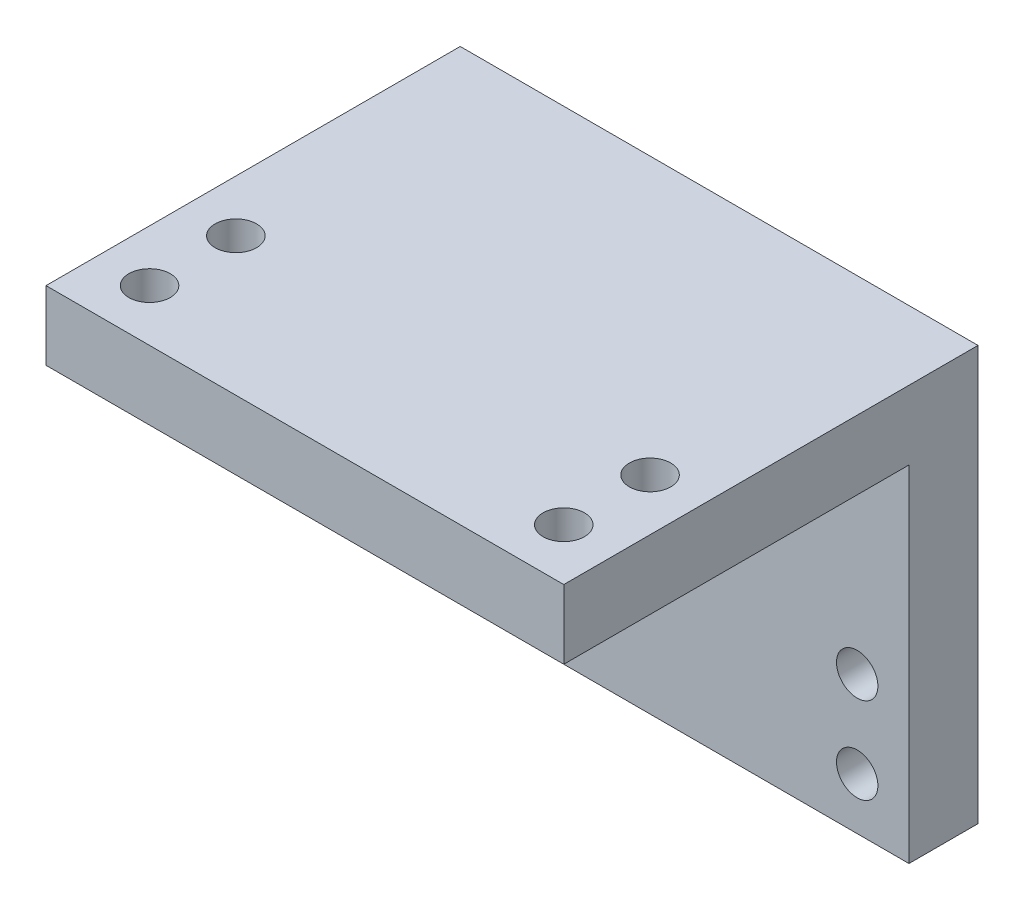
ISO-10303-21;
HEADER;
FILE_DESCRIPTION(('STEP AP214'),'2;1');
FILE_NAME('part.step','',(''),(''),'','','');
FILE_SCHEMA(('AUTOMOTIVE_DESIGN { 1 0 10303 214 1 1 1 1 }'));
ENDSEC;
DATA;
#1=APPLICATION_CONTEXT('core data for automotive mechanical design processes');
#2=APPLICATION_PROTOCOL_DEFINITION('international standard','automotive_design',2000,#1);
#3=PRODUCT_CONTEXT('',#1,'mechanical');
#4=PRODUCT('Part','Part','',(#3));
#5=PRODUCT_RELATED_PRODUCT_CATEGORY('part','',(#4));
#6=PRODUCT_DEFINITION_FORMATION('','',#4);
#7=PRODUCT_DEFINITION_CONTEXT('part definition',#1,'design');
#8=PRODUCT_DEFINITION('design','',#6,#7);
#9=PRODUCT_DEFINITION_SHAPE('','',#8);
#10=(LENGTH_UNIT() NAMED_UNIT(*) SI_UNIT(.MILLI.,.METRE.));
#11=(NAMED_UNIT(*) PLANE_ANGLE_UNIT() SI_UNIT($,.RADIAN.));
#12=(NAMED_UNIT(*) SI_UNIT($,.STERADIAN.) SOLID_ANGLE_UNIT());
#13=UNCERTAINTY_MEASURE_WITH_UNIT(LENGTH_MEASURE(1.E-05),#10,'distance_accuracy_value','');
#14=(GEOMETRIC_REPRESENTATION_CONTEXT(3) GLOBAL_UNCERTAINTY_ASSIGNED_CONTEXT((#13)) GLOBAL_UNIT_ASSIGNED_CONTEXT((#10,
#11,#12)) REPRESENTATION_CONTEXT('',''));
#15=CARTESIAN_POINT('',(0.,0.,0.));
#16=DIRECTION('',(0.,0.,1.));
#17=DIRECTION('',(1.,0.,0.));
#18=AXIS2_PLACEMENT_3D('',#15,#16,#17);
#19=CARTESIAN_POINT('',(38.1,-21.9756544502618,2.18094240837696));
#20=DIRECTION('',(0.,0.,-1.));
#21=DIRECTION('',(-1.,0.,0.));
#22=AXIS2_PLACEMENT_3D('',#19,#20,#21);
#23=PLANE('',#22);
#24=DIRECTION('',(0.,-1.,0.));
#25=VECTOR('',#24,1.);
#26=CARTESIAN_POINT('',(0.,-21.9756544502618,2.18094240837696));
#27=LINE('',#26,#25);
#28=CARTESIAN_POINT('',(0.,-16.8956544502618,2.18094240837696));
#29=VERTEX_POINT('',#28);
#30=CARTESIAN_POINT('',(0.,-21.9756544502618,2.18094240837696));
#31=VERTEX_POINT('',#30);
#32=EDGE_CURVE('E123',#29,#31,#27,.T.);
#33=ORIENTED_EDGE('',*,*,#32,.T.);
#34=DIRECTION('',(-1.,0.,0.));
#35=VECTOR('',#34,1.);
#36=CARTESIAN_POINT('',(38.1,-21.9756544502618,2.18094240837696));
#37=LINE('',#36,#35);
#38=CARTESIAN_POINT('',(38.1,-21.9756544502618,2.18094240837696));
#39=VERTEX_POINT('',#38);
#40=EDGE_CURVE('E11',#39,#31,#37,.T.);
#41=ORIENTED_EDGE('',*,*,#40,.F.);
#42=DIRECTION('',(0.,-1.,0.));
#43=VECTOR('',#42,1.);
#44=CARTESIAN_POINT('',(38.1,-21.9756544502618,2.18094240837696));
#45=LINE('',#44,#43);
#46=CARTESIAN_POINT('',(38.1,-16.8956544502618,2.18094240837696));
#47=VERTEX_POINT('',#46);
#48=EDGE_CURVE('E134',#47,#39,#45,.T.);
#49=ORIENTED_EDGE('',*,*,#48,.F.);
#50=DIRECTION('',(-1.,0.,0.));
#51=VECTOR('',#50,1.);
#52=CARTESIAN_POINT('',(38.1,-16.8956544502618,2.18094240837696));
#53=LINE('',#52,#51);
#54=EDGE_CURVE('E119',#47,#29,#53,.T.);
#55=ORIENTED_EDGE('',*,*,#54,.T.);
#56=EDGE_LOOP('',(#33,#41,#49,#55));
#57=FACE_BOUND('',#56,.T.);
#58=ADVANCED_FACE('F39',(#57),#23,.F.);
#59=CARTESIAN_POINT('',(38.1,-21.9756544502618,-23.219057591623));
#60=DIRECTION('',(0.,1.,0.));
#61=DIRECTION('',(0.,0.,1.));
#62=AXIS2_PLACEMENT_3D('',#59,#60,#61);
#63=PLANE('',#62);
#64=CARTESIAN_POINT('',(34.29,-21.9756544502618,-1.62905759162304));
#65=DIRECTION('',(0.,1.,0.));
#66=DIRECTION('',(0.,0.,1.));
#67=AXIS2_PLACEMENT_3D('',#64,#65,#66);
#68=CIRCLE('',#67,1.524);
#69=CARTESIAN_POINT('',(34.29,-21.9756544502618,-0.105057591623037));
#70=VERTEX_POINT('',#69);
#71=EDGE_CURVE('E343',#70,#70,#68,.T.);
#72=ORIENTED_EDGE('',*,*,#71,.T.);
#73=EDGE_LOOP('',(#72));
#74=FACE_BOUND('',#73,.T.);
#75=CARTESIAN_POINT('',(3.80999999999998,-21.9756544502618,-7.97905759162304));
#76=DIRECTION('',(0.,1.,0.));
#77=DIRECTION('',(0.,0.,1.));
#78=AXIS2_PLACEMENT_3D('',#75,#76,#77);
#79=CIRCLE('',#78,1.524);
#80=CARTESIAN_POINT('',(3.80999999999998,-21.9756544502618,-6.45505759162303));
#81=VERTEX_POINT('',#80);
#82=EDGE_CURVE('E345',#81,#81,#79,.T.);
#83=ORIENTED_EDGE('',*,*,#82,.T.);
#84=EDGE_LOOP('',(#83));
#85=FACE_BOUND('',#84,.T.);
#86=CARTESIAN_POINT('',(34.29,-21.9756544502618,-7.97905759162304));
#87=DIRECTION('',(0.,1.,0.));
#88=DIRECTION('',(0.,0.,1.));
#89=AXIS2_PLACEMENT_3D('',#86,#87,#88);
#90=CIRCLE('',#89,1.524);
#91=CARTESIAN_POINT('',(34.29,-21.9756544502618,-6.45505759162304));
#92=VERTEX_POINT('',#91);
#93=EDGE_CURVE('E351',#92,#92,#90,.T.);
#94=ORIENTED_EDGE('',*,*,#93,.T.);
#95=EDGE_LOOP('',(#94));
#96=FACE_BOUND('',#95,.T.);
#97=CARTESIAN_POINT('',(3.81,-21.9756544502618,-1.62905759162304));
#98=DIRECTION('',(0.,1.,0.));
#99=DIRECTION('',(0.,0.,1.));
#100=AXIS2_PLACEMENT_3D('',#97,#98,#99);
#101=CIRCLE('',#100,1.524);
#102=CARTESIAN_POINT('',(3.81,-21.9756544502618,-0.105057591623035));
#103=VERTEX_POINT('',#102);
#104=EDGE_CURVE('E395',#103,#103,#101,.T.);
#105=ORIENTED_EDGE('',*,*,#104,.T.);
#106=EDGE_LOOP('',(#105));
#107=FACE_BOUND('',#106,.T.);
#108=DIRECTION('',(0.,0.,-1.));
#109=VECTOR('',#108,1.);
#110=CARTESIAN_POINT('',(0.,-21.9756544502618,-23.219057591623));
#111=LINE('',#110,#109);
#112=CARTESIAN_POINT('',(0.,-21.9756544502618,-23.219057591623));
#113=VERTEX_POINT('',#112);
#114=EDGE_CURVE('E126',#31,#113,#111,.T.);
#115=ORIENTED_EDGE('',*,*,#114,.T.);
#116=DIRECTION('',(-1.,0.,0.));
#117=VECTOR('',#116,1.);
#118=CARTESIAN_POINT('',(38.1,-21.9756544502618,-23.219057591623));
#119=LINE('',#118,#117);
#120=CARTESIAN_POINT('',(38.1,-21.9756544502618,-23.219057591623));
#121=VERTEX_POINT('',#120);
#122=EDGE_CURVE('E47',#121,#113,#119,.T.);
#123=ORIENTED_EDGE('',*,*,#122,.F.);
#124=DIRECTION('',(0.,0.,-1.));
#125=VECTOR('',#124,1.);
#126=CARTESIAN_POINT('',(38.1,-21.9756544502618,-23.219057591623));
#127=LINE('',#126,#125);
#128=EDGE_CURVE('E92',#39,#121,#127,.T.);
#129=ORIENTED_EDGE('',*,*,#128,.F.);
#130=ORIENTED_EDGE('',*,*,#40,.T.);
#131=EDGE_LOOP('',(#115,#123,#129,#130));
#132=FACE_BOUND('',#131,.T.);
#133=ADVANCED_FACE('F162',(#74,#85,#96,#107,#132),#63,.F.);
#134=CARTESIAN_POINT('',(38.1,-47.3756544502618,-23.219057591623));
#135=DIRECTION('',(0.,0.,-1.));
#136=DIRECTION('',(-1.,0.,0.));
#137=AXIS2_PLACEMENT_3D('',#134,#135,#136);
#138=PLANE('',#137);
#139=CARTESIAN_POINT('',(3.81,-43.5656544502618,-23.219057591623));
#140=DIRECTION('',(0.,0.,-1.));
#141=DIRECTION('',(-1.,0.,0.));
#142=AXIS2_PLACEMENT_3D('',#139,#140,#141);
#143=CIRCLE('',#142,1.524);
#144=CARTESIAN_POINT('',(2.286,-43.5656544502618,-23.219057591623));
#145=VERTEX_POINT('',#144);
#146=EDGE_CURVE('E127',#145,#145,#143,.T.);
#147=ORIENTED_EDGE('',*,*,#146,.T.);
#148=EDGE_LOOP('',(#147));
#149=FACE_BOUND('',#148,.T.);
#150=CARTESIAN_POINT('',(34.29,-37.2156544502618,-23.219057591623));
#151=DIRECTION('',(0.,0.,-1.));
#152=DIRECTION('',(-1.,0.,0.));
#153=AXIS2_PLACEMENT_3D('',#150,#151,#152);
#154=CIRCLE('',#153,1.524);
#155=CARTESIAN_POINT('',(32.766,-37.2156544502618,-23.219057591623));
#156=VERTEX_POINT('',#155);
#157=EDGE_CURVE('E369',#156,#156,#154,.T.);
#158=ORIENTED_EDGE('',*,*,#157,.T.);
#159=EDGE_LOOP('',(#158));
#160=FACE_BOUND('',#159,.T.);
#161=CARTESIAN_POINT('',(3.81000000000003,-37.2156544502618,-23.219057591623));
#162=DIRECTION('',(0.,0.,-1.));
#163=DIRECTION('',(-1.,0.,0.));
#164=AXIS2_PLACEMENT_3D('',#161,#162,#163);
#165=CIRCLE('',#164,1.524);
#166=CARTESIAN_POINT('',(2.28600000000003,-37.2156544502618,-23.219057591623));
#167=VERTEX_POINT('',#166);
#168=EDGE_CURVE('E366',#167,#167,#165,.T.);
#169=ORIENTED_EDGE('',*,*,#168,.T.);
#170=EDGE_LOOP('',(#169));
#171=FACE_BOUND('',#170,.T.);
#172=CARTESIAN_POINT('',(34.29,-43.5656544502618,-23.219057591623));
#173=DIRECTION('',(0.,0.,-1.));
#174=DIRECTION('',(-1.,0.,0.));
#175=AXIS2_PLACEMENT_3D('',#172,#173,#174);
#176=CIRCLE('',#175,1.524);
#177=CARTESIAN_POINT('',(32.766,-43.5656544502618,-23.219057591623));
#178=VERTEX_POINT('',#177);
#179=EDGE_CURVE('E363',#178,#178,#176,.T.);
#180=ORIENTED_EDGE('',*,*,#179,.T.);
#181=EDGE_LOOP('',(#180));
#182=FACE_BOUND('',#181,.T.);
#183=DIRECTION('',(0.,-1.,0.));
#184=VECTOR('',#183,1.);
#185=CARTESIAN_POINT('',(0.,-47.3756544502618,-23.219057591623));
#186=LINE('',#185,#184);
#187=CARTESIAN_POINT('',(0.,-47.3756544502618,-23.219057591623));
#188=VERTEX_POINT('',#187);
#189=EDGE_CURVE('E129',#113,#188,#186,.T.);
#190=ORIENTED_EDGE('',*,*,#189,.T.);
#191=DIRECTION('',(-1.,0.,0.));
#192=VECTOR('',#191,1.);
#193=CARTESIAN_POINT('',(38.1,-47.3756544502618,-23.219057591623));
#194=LINE('',#193,#192);
#195=CARTESIAN_POINT('',(38.1,-47.3756544502618,-23.219057591623));
#196=VERTEX_POINT('',#195);
#197=EDGE_CURVE('E114',#196,#188,#194,.T.);
#198=ORIENTED_EDGE('',*,*,#197,.F.);
#199=DIRECTION('',(0.,-1.,0.));
#200=VECTOR('',#199,1.);
#201=CARTESIAN_POINT('',(38.1,-47.3756544502618,-23.219057591623));
#202=LINE('',#201,#200);
#203=EDGE_CURVE('E105',#121,#196,#202,.T.);
#204=ORIENTED_EDGE('',*,*,#203,.F.);
#205=ORIENTED_EDGE('',*,*,#122,.T.);
#206=EDGE_LOOP('',(#190,#198,#204,#205));
#207=FACE_BOUND('',#206,.T.);
#208=ADVANCED_FACE('F140',(#149,#160,#171,#182,#207),#138,.F.);
#209=CARTESIAN_POINT('',(38.1,-47.3756544502618,-28.299057591623));
#210=DIRECTION('',(0.,1.,0.));
#211=DIRECTION('',(0.,0.,1.));
#212=AXIS2_PLACEMENT_3D('',#209,#210,#211);
#213=PLANE('',#212);
#214=DIRECTION('',(0.,0.,-1.));
#215=VECTOR('',#214,1.);
#216=CARTESIAN_POINT('',(0.,-47.3756544502618,-28.299057591623));
#217=LINE('',#216,#215);
#218=CARTESIAN_POINT('',(0.,-47.3756544502618,-28.299057591623));
#219=VERTEX_POINT('',#218);
#220=EDGE_CURVE('E113',#188,#219,#217,.T.);
#221=ORIENTED_EDGE('',*,*,#220,.T.);
#222=DIRECTION('',(-1.,0.,0.));
#223=VECTOR('',#222,1.);
#224=CARTESIAN_POINT('',(38.1,-47.3756544502618,-28.299057591623));
#225=LINE('',#224,#223);
#226=CARTESIAN_POINT('',(38.1,-47.3756544502618,-28.299057591623));
#227=VERTEX_POINT('',#226);
#228=EDGE_CURVE('E110',#227,#219,#225,.T.);
#229=ORIENTED_EDGE('',*,*,#228,.F.);
#230=DIRECTION('',(0.,0.,-1.));
#231=VECTOR('',#230,1.);
#232=CARTESIAN_POINT('',(38.1,-47.3756544502618,-28.299057591623));
#233=LINE('',#232,#231);
#234=EDGE_CURVE('E99',#196,#227,#233,.T.);
#235=ORIENTED_EDGE('',*,*,#234,.F.);
#236=ORIENTED_EDGE('',*,*,#197,.T.);
#237=EDGE_LOOP('',(#221,#229,#235,#236));
#238=FACE_BOUND('',#237,.T.);
#239=ADVANCED_FACE('F111',(#238),#213,.F.);
#240=CARTESIAN_POINT('',(38.1,-16.8956544502618,-28.299057591623));
#241=DIRECTION('',(0.,0.,1.));
#242=DIRECTION('',(1.,0.,0.));
#243=AXIS2_PLACEMENT_3D('',#240,#241,#242);
#244=PLANE('',#243);
#245=CARTESIAN_POINT('',(3.81,-43.5656544502618,-28.299057591623));
#246=DIRECTION('',(0.,0.,-1.));
#247=DIRECTION('',(0.,1.,0.));
#248=AXIS2_PLACEMENT_3D('',#245,#246,#247);
#249=CIRCLE('',#248,1.524);
#250=CARTESIAN_POINT('',(3.81,-42.0416544502618,-28.299057591623));
#251=VERTEX_POINT('',#250);
#252=EDGE_CURVE('E355',#251,#251,#249,.T.);
#253=ORIENTED_EDGE('',*,*,#252,.F.);
#254=EDGE_LOOP('',(#253));
#255=FACE_BOUND('',#254,.T.);
#256=CARTESIAN_POINT('',(34.29,-37.2156544502618,-28.299057591623));
#257=DIRECTION('',(0.,0.,-1.));
#258=DIRECTION('',(0.,1.,0.));
#259=AXIS2_PLACEMENT_3D('',#256,#257,#258);
#260=CIRCLE('',#259,1.524);
#261=CARTESIAN_POINT('',(34.29,-35.6916544502618,-28.299057591623));
#262=VERTEX_POINT('',#261);
#263=EDGE_CURVE('E348',#262,#262,#260,.T.);
#264=ORIENTED_EDGE('',*,*,#263,.F.);
#265=EDGE_LOOP('',(#264));
#266=FACE_BOUND('',#265,.T.);
#267=CARTESIAN_POINT('',(3.81000000000003,-37.2156544502618,-28.299057591623));
#268=DIRECTION('',(0.,0.,-1.));
#269=DIRECTION('',(0.,1.,0.));
#270=AXIS2_PLACEMENT_3D('',#267,#268,#269);
#271=CIRCLE('',#270,1.524);
#272=CARTESIAN_POINT('',(3.81000000000003,-35.6916544502618,-28.299057591623));
#273=VERTEX_POINT('',#272);
#274=EDGE_CURVE('E344',#273,#273,#271,.T.);
#275=ORIENTED_EDGE('',*,*,#274,.F.);
#276=EDGE_LOOP('',(#275));
#277=FACE_BOUND('',#276,.T.);
#278=CARTESIAN_POINT('',(34.29,-43.5656544502618,-28.299057591623));
#279=DIRECTION('',(0.,0.,-1.));
#280=DIRECTION('',(0.,1.,0.));
#281=AXIS2_PLACEMENT_3D('',#278,#279,#280);
#282=CIRCLE('',#281,1.524);
#283=CARTESIAN_POINT('',(34.29,-42.0416544502618,-28.299057591623));
#284=VERTEX_POINT('',#283);
#285=EDGE_CURVE('E358',#284,#284,#282,.T.);
#286=ORIENTED_EDGE('',*,*,#285,.F.);
#287=EDGE_LOOP('',(#286));
#288=FACE_BOUND('',#287,.T.);
#289=DIRECTION('',(0.,1.,0.));
#290=VECTOR('',#289,1.);
#291=CARTESIAN_POINT('',(0.,-16.8956544502618,-28.299057591623));
#292=LINE('',#291,#290);
#293=CARTESIAN_POINT('',(0.,-16.8956544502618,-28.299057591623));
#294=VERTEX_POINT('',#293);
#295=EDGE_CURVE('E78',#219,#294,#292,.T.);
#296=ORIENTED_EDGE('',*,*,#295,.T.);
#297=DIRECTION('',(-1.,0.,0.));
#298=VECTOR('',#297,1.);
#299=CARTESIAN_POINT('',(38.1,-16.8956544502618,-28.299057591623));
#300=LINE('',#299,#298);
#301=CARTESIAN_POINT('',(38.1,-16.8956544502618,-28.299057591623));
#302=VERTEX_POINT('',#301);
#303=EDGE_CURVE('E115',#302,#294,#300,.T.);
#304=ORIENTED_EDGE('',*,*,#303,.F.);
#305=DIRECTION('',(0.,1.,0.));
#306=VECTOR('',#305,1.);
#307=CARTESIAN_POINT('',(38.1,-16.8956544502618,-28.299057591623));
#308=LINE('',#307,#306);
#309=EDGE_CURVE('E103',#227,#302,#308,.T.);
#310=ORIENTED_EDGE('',*,*,#309,.F.);
#311=ORIENTED_EDGE('',*,*,#228,.T.);
#312=EDGE_LOOP('',(#296,#304,#310,#311));
#313=FACE_BOUND('',#312,.T.);
#314=ADVANCED_FACE('F117',(#255,#266,#277,#288,#313),#244,.F.);
#315=CARTESIAN_POINT('',(38.1,-16.8956544502618,2.18094240837696));
#316=DIRECTION('',(0.,-1.,0.));
#317=DIRECTION('',(0.,0.,-1.));
#318=AXIS2_PLACEMENT_3D('',#315,#316,#317);
#319=PLANE('',#318);
#320=CARTESIAN_POINT('',(34.29,-16.8956544502618,-1.62905759162304));
#321=DIRECTION('',(0.,1.,0.));
#322=DIRECTION('',(0.,0.,1.));
#323=AXIS2_PLACEMENT_3D('',#320,#321,#322);
#324=CIRCLE('',#323,1.524);
#325=CARTESIAN_POINT('',(34.29,-16.8956544502618,-0.105057591623037));
#326=VERTEX_POINT('',#325);
#327=EDGE_CURVE('E341',#326,#326,#324,.T.);
#328=ORIENTED_EDGE('',*,*,#327,.F.);
#329=EDGE_LOOP('',(#328));
#330=FACE_BOUND('',#329,.T.);
#331=CARTESIAN_POINT('',(3.80999999999998,-16.8956544502618,-7.97905759162304));
#332=DIRECTION('',(0.,1.,0.));
#333=DIRECTION('',(0.,0.,1.));
#334=AXIS2_PLACEMENT_3D('',#331,#332,#333);
#335=CIRCLE('',#334,1.524);
#336=CARTESIAN_POINT('',(3.80999999999998,-16.8956544502618,-6.45505759162303));
#337=VERTEX_POINT('',#336);
#338=EDGE_CURVE('E401',#337,#337,#335,.T.);
#339=ORIENTED_EDGE('',*,*,#338,.F.);
#340=EDGE_LOOP('',(#339));
#341=FACE_BOUND('',#340,.T.);
#342=CARTESIAN_POINT('',(34.29,-16.8956544502618,-7.97905759162304));
#343=DIRECTION('',(0.,1.,0.));
#344=DIRECTION('',(0.,0.,1.));
#345=AXIS2_PLACEMENT_3D('',#342,#343,#344);
#346=CIRCLE('',#345,1.524);
#347=CARTESIAN_POINT('',(34.29,-16.8956544502618,-6.45505759162304));
#348=VERTEX_POINT('',#347);
#349=EDGE_CURVE('E404',#348,#348,#346,.T.);
#350=ORIENTED_EDGE('',*,*,#349,.F.);
#351=EDGE_LOOP('',(#350));
#352=FACE_BOUND('',#351,.T.);
#353=CARTESIAN_POINT('',(3.81,-16.8956544502618,-1.62905759162304));
#354=DIRECTION('',(0.,1.,0.));
#355=DIRECTION('',(0.,0.,1.));
#356=AXIS2_PLACEMENT_3D('',#353,#354,#355);
#357=CIRCLE('',#356,1.524);
#358=CARTESIAN_POINT('',(3.81,-16.8956544502618,-0.105057591623035));
#359=VERTEX_POINT('',#358);
#360=EDGE_CURVE('E398',#359,#359,#357,.T.);
#361=ORIENTED_EDGE('',*,*,#360,.F.);
#362=EDGE_LOOP('',(#361));
#363=FACE_BOUND('',#362,.T.);
#364=DIRECTION('',(0.,0.,1.));
#365=VECTOR('',#364,1.);
#366=CARTESIAN_POINT('',(0.,-16.8956544502618,2.18094240837696));
#367=LINE('',#366,#365);
#368=EDGE_CURVE('E84',#294,#29,#367,.T.);
#369=ORIENTED_EDGE('',*,*,#368,.T.);
#370=ORIENTED_EDGE('',*,*,#54,.F.);
#371=DIRECTION('',(0.,0.,1.));
#372=VECTOR('',#371,1.);
#373=CARTESIAN_POINT('',(38.1,-16.8956544502618,2.18094240837696));
#374=LINE('',#373,#372);
#375=EDGE_CURVE('E55',#302,#47,#374,.T.);
#376=ORIENTED_EDGE('',*,*,#375,.F.);
#377=ORIENTED_EDGE('',*,*,#303,.T.);
#378=EDGE_LOOP('',(#369,#370,#376,#377));
#379=FACE_BOUND('',#378,.T.);
#380=ADVANCED_FACE('F147',(#330,#341,#352,#363,#379),#319,.F.);
#381=CARTESIAN_POINT('',(38.1,0.,0.));
#382=DIRECTION('',(-1.,0.,0.));
#383=DIRECTION('',(0.,0.,1.));
#384=AXIS2_PLACEMENT_3D('',#381,#382,#383);
#385=PLANE('',#384);
#386=ORIENTED_EDGE('',*,*,#48,.T.);
#387=ORIENTED_EDGE('',*,*,#128,.T.);
#388=ORIENTED_EDGE('',*,*,#203,.T.);
#389=ORIENTED_EDGE('',*,*,#234,.T.);
#390=ORIENTED_EDGE('',*,*,#309,.T.);
#391=ORIENTED_EDGE('',*,*,#375,.T.);
#392=EDGE_LOOP('',(#386,#387,#388,#389,#390,#391));
#393=FACE_BOUND('',#392,.T.);
#394=ADVANCED_FACE('F101',(#393),#385,.F.);
#395=CARTESIAN_POINT('',(0.,0.,0.));
#396=DIRECTION('',(-1.,0.,0.));
#397=DIRECTION('',(0.,0.,1.));
#398=AXIS2_PLACEMENT_3D('',#395,#396,#397);
#399=PLANE('',#398);
#400=ORIENTED_EDGE('',*,*,#32,.F.);
#401=ORIENTED_EDGE('',*,*,#368,.F.);
#402=ORIENTED_EDGE('',*,*,#295,.F.);
#403=ORIENTED_EDGE('',*,*,#220,.F.);
#404=ORIENTED_EDGE('',*,*,#189,.F.);
#405=ORIENTED_EDGE('',*,*,#114,.F.);
#406=EDGE_LOOP('',(#400,#401,#402,#403,#404,#405));
#407=FACE_BOUND('',#406,.T.);
#408=ADVANCED_FACE('F143',(#407),#399,.T.);
#409=CARTESIAN_POINT('',(34.29,-43.5656544502618,2.18094240837697));
#410=DIRECTION('',(0.,0.,-1.));
#411=DIRECTION('',(0.,1.,0.));
#412=AXIS2_PLACEMENT_3D('',#409,#410,#411);
#413=CYLINDRICAL_SURFACE('',#412,1.524);
#414=ORIENTED_EDGE('',*,*,#285,.T.);
#415=EDGE_LOOP('',(#414));
#416=FACE_BOUND('',#415,.T.);
#417=ORIENTED_EDGE('',*,*,#179,.F.);
#418=EDGE_LOOP('',(#417));
#419=FACE_BOUND('',#418,.T.);
#420=ADVANCED_FACE('F201',(#416,#419),#413,.F.);
#421=CARTESIAN_POINT('',(3.81000000000003,-37.2156544502618,2.18094240837697));
#422=DIRECTION('',(0.,0.,-1.));
#423=DIRECTION('',(0.,1.,0.));
#424=AXIS2_PLACEMENT_3D('',#421,#422,#423);
#425=CYLINDRICAL_SURFACE('',#424,1.524);
#426=ORIENTED_EDGE('',*,*,#274,.T.);
#427=EDGE_LOOP('',(#426));
#428=FACE_BOUND('',#427,.T.);
#429=ORIENTED_EDGE('',*,*,#168,.F.);
#430=EDGE_LOOP('',(#429));
#431=FACE_BOUND('',#430,.T.);
#432=ADVANCED_FACE('F208',(#428,#431),#425,.F.);
#433=CARTESIAN_POINT('',(34.29,-37.2156544502618,2.18094240837697));
#434=DIRECTION('',(0.,0.,-1.));
#435=DIRECTION('',(0.,1.,0.));
#436=AXIS2_PLACEMENT_3D('',#433,#434,#435);
#437=CYLINDRICAL_SURFACE('',#436,1.524);
#438=ORIENTED_EDGE('',*,*,#263,.T.);
#439=EDGE_LOOP('',(#438));
#440=FACE_BOUND('',#439,.T.);
#441=ORIENTED_EDGE('',*,*,#157,.F.);
#442=EDGE_LOOP('',(#441));
#443=FACE_BOUND('',#442,.T.);
#444=ADVANCED_FACE('F216',(#440,#443),#437,.F.);
#445=CARTESIAN_POINT('',(3.81,-43.5656544502618,2.18094240837697));
#446=DIRECTION('',(0.,0.,-1.));
#447=DIRECTION('',(0.,1.,0.));
#448=AXIS2_PLACEMENT_3D('',#445,#446,#447);
#449=CYLINDRICAL_SURFACE('',#448,1.524);
#450=ORIENTED_EDGE('',*,*,#252,.T.);
#451=EDGE_LOOP('',(#450));
#452=FACE_BOUND('',#451,.T.);
#453=ORIENTED_EDGE('',*,*,#146,.F.);
#454=EDGE_LOOP('',(#453));
#455=FACE_BOUND('',#454,.T.);
#456=ADVANCED_FACE('F224',(#452,#455),#449,.F.);
#457=CARTESIAN_POINT('',(3.81,-47.3756544502618,-1.62905759162304));
#458=DIRECTION('',(0.,1.,0.));
#459=DIRECTION('',(0.,0.,1.));
#460=AXIS2_PLACEMENT_3D('',#457,#458,#459);
#461=CYLINDRICAL_SURFACE('',#460,1.524);
#462=CARTESIAN_POINT('',(3.81,-16.8956544502618,-0.105057591623035));
#463=CARTESIAN_POINT('',(3.81,-16.9485711169284,-0.105057591623035));
#464=CARTESIAN_POINT('',(3.81,-17.0014877835951,-0.105057591623035));
#465=CARTESIAN_POINT('',(3.81,-17.1073211169284,-0.105057591623035));
#466=CARTESIAN_POINT('',(3.81,-17.1602377835951,-0.105057591623035));
#467=CARTESIAN_POINT('',(3.81,-17.2660711169284,-0.105057591623035));
#468=CARTESIAN_POINT('',(3.81,-17.3189877835951,-0.105057591623035));
#469=CARTESIAN_POINT('',(3.81,-17.4248211169284,-0.105057591623035));
#470=CARTESIAN_POINT('',(3.81,-17.4777377835951,-0.105057591623035));
#471=CARTESIAN_POINT('',(3.81,-17.5835711169284,-0.105057591623035));
#472=CARTESIAN_POINT('',(3.81,-17.6364877835951,-0.105057591623035));
#473=CARTESIAN_POINT('',(3.81,-17.7423211169284,-0.105057591623035));
#474=CARTESIAN_POINT('',(3.81,-17.7952377835951,-0.105057591623035));
#475=CARTESIAN_POINT('',(3.81,-17.9010711169284,-0.105057591623035));
#476=CARTESIAN_POINT('',(3.81,-17.9539877835951,-0.105057591623035));
#477=CARTESIAN_POINT('',(3.81,-18.0598211169284,-0.105057591623035));
#478=CARTESIAN_POINT('',(3.81,-18.1127377835951,-0.105057591623035));
#479=CARTESIAN_POINT('',(3.81,-18.2185711169284,-0.105057591623035));
#480=CARTESIAN_POINT('',(3.81,-18.2714877835951,-0.105057591623035));
#481=CARTESIAN_POINT('',(3.81,-18.3773211169284,-0.105057591623035));
#482=CARTESIAN_POINT('',(3.81,-18.4302377835951,-0.105057591623035));
#483=CARTESIAN_POINT('',(3.81,-18.5360711169284,-0.105057591623035));
#484=CARTESIAN_POINT('',(3.81,-18.5889877835951,-0.105057591623035));
#485=CARTESIAN_POINT('',(3.81,-18.6948211169284,-0.105057591623035));
#486=CARTESIAN_POINT('',(3.81,-18.7477377835951,-0.105057591623035));
#487=CARTESIAN_POINT('',(3.81,-18.8535711169284,-0.105057591623035));
#488=CARTESIAN_POINT('',(3.81,-18.9064877835951,-0.105057591623035));
#489=CARTESIAN_POINT('',(3.81,-19.0123211169284,-0.105057591623035));
#490=CARTESIAN_POINT('',(3.81,-19.0652377835951,-0.105057591623035));
#491=CARTESIAN_POINT('',(3.81,-19.1710711169284,-0.105057591623035));
#492=CARTESIAN_POINT('',(3.81,-19.2239877835951,-0.105057591623035));
#493=CARTESIAN_POINT('',(3.81,-19.3298211169284,-0.105057591623035));
#494=CARTESIAN_POINT('',(3.81,-19.3827377835951,-0.105057591623035));
#495=CARTESIAN_POINT('',(3.81,-19.4885711169284,-0.105057591623035));
#496=CARTESIAN_POINT('',(3.81,-19.5414877835951,-0.105057591623035));
#497=CARTESIAN_POINT('',(3.81,-19.6473211169284,-0.105057591623035));
#498=CARTESIAN_POINT('',(3.81,-19.7002377835951,-0.105057591623035));
#499=CARTESIAN_POINT('',(3.81,-19.8060711169284,-0.105057591623035));
#500=CARTESIAN_POINT('',(3.81,-19.8589877835951,-0.105057591623035));
#501=CARTESIAN_POINT('',(3.81,-19.9648211169284,-0.105057591623035));
#502=CARTESIAN_POINT('',(3.81,-20.0177377835951,-0.105057591623035));
#503=CARTESIAN_POINT('',(3.81,-20.1235711169284,-0.105057591623035));
#504=CARTESIAN_POINT('',(3.81,-20.1764877835951,-0.105057591623035));
#505=CARTESIAN_POINT('',(3.81,-20.2823211169284,-0.105057591623035));
#506=CARTESIAN_POINT('',(3.81,-20.3352377835951,-0.105057591623035));
#507=CARTESIAN_POINT('',(3.81,-20.4410711169284,-0.105057591623035));
#508=CARTESIAN_POINT('',(3.81,-20.4939877835951,-0.105057591623035));
#509=CARTESIAN_POINT('',(3.81,-20.5998211169284,-0.105057591623035));
#510=CARTESIAN_POINT('',(3.81,-20.6527377835951,-0.105057591623035));
#511=CARTESIAN_POINT('',(3.81,-20.7585711169284,-0.105057591623035));
#512=CARTESIAN_POINT('',(3.81,-20.8114877835951,-0.105057591623035));
#513=CARTESIAN_POINT('',(3.81,-20.9173211169284,-0.105057591623035));
#514=CARTESIAN_POINT('',(3.81,-20.9702377835951,-0.105057591623035));
#515=CARTESIAN_POINT('',(3.81,-21.0760711169284,-0.105057591623035));
#516=CARTESIAN_POINT('',(3.81,-21.1289877835951,-0.105057591623035));
#517=CARTESIAN_POINT('',(3.81,-21.2348211169284,-0.105057591623035));
#518=CARTESIAN_POINT('',(3.81,-21.2877377835951,-0.105057591623035));
#519=CARTESIAN_POINT('',(3.81,-21.3935711169284,-0.105057591623035));
#520=CARTESIAN_POINT('',(3.81,-21.4464877835951,-0.105057591623035));
#521=CARTESIAN_POINT('',(3.81,-21.5523211169284,-0.105057591623035));
#522=CARTESIAN_POINT('',(3.81,-21.6052377835951,-0.105057591623035));
#523=CARTESIAN_POINT('',(3.81,-21.7110711169284,-0.105057591623035));
#524=CARTESIAN_POINT('',(3.81,-21.7639877835951,-0.105057591623035));
#525=CARTESIAN_POINT('',(3.81,-21.8698211169284,-0.105057591623035));
#526=CARTESIAN_POINT('',(3.81,-21.9227377835951,-0.105057591623035));
#527=CARTESIAN_POINT('',(3.81,-21.9756544502618,-0.105057591623035));
#528=B_SPLINE_CURVE_WITH_KNOTS('',3,(#462,#463,#464,#465,#466,#467,#468,#469,#470,#471,#472,
#473,#474,#475,#476,#477,#478,#479,#480,#481,#482,#483,#484,#485,#486,#487,#488,#489,#490,#491,
#492,#493,#494,#495,#496,#497,#498,#499,#500,#501,#502,#503,#504,#505,#506,#507,#508,#509,#510,
#511,#512,#513,#514,#515,#516,#517,#518,#519,#520,#521,#522,#523,#524,#525,#526,#527),
.UNSPECIFIED.,.F.,.F.,(4,2,2,2,2,2,2,2,2,2,2,2,2,2,2,2,2,2,2,2,2,2,2,2,2,2,2,2,2,2,2,2,4),(0.,
0.158749999999999,0.317499999999998,0.476250000000001,0.635,0.793749999999999,0.952500000000002,
1.11125,1.27,1.42875,1.5875,1.74625,1.905,2.06375,2.2225,2.38125,2.54,2.69875,2.8575,3.01625,
3.175,3.33375,3.4925,3.65125,3.81,3.96875,4.1275,4.28625,4.445,4.60375,4.7625,4.92125,5.08),.UNSPECIFIED.);
#529=EDGE_CURVE('BSEAM232',#359,#103,#528,.T.);
#530=ORIENTED_EDGE('',*,*,#360,.T.);
#531=ORIENTED_EDGE('',*,*,#104,.F.);
#532=ORIENTED_EDGE('',*,*,#529,.T.);
#533=ORIENTED_EDGE('',*,*,#529,.F.);
#534=EDGE_LOOP('',(#530,#532,#531,#533));
#535=FACE_BOUND('',#534,.T.);
#536=ADVANCED_FACE('F232',(#535),#461,.F.);
#537=CARTESIAN_POINT('',(34.29,-47.3756544502618,-7.97905759162304));
#538=DIRECTION('',(0.,1.,0.));
#539=DIRECTION('',(0.,0.,1.));
#540=AXIS2_PLACEMENT_3D('',#537,#538,#539);
#541=CYLINDRICAL_SURFACE('',#540,1.524);
#542=CARTESIAN_POINT('',(34.29,-16.8956544502618,-6.45505759162304));
#543=CARTESIAN_POINT('',(34.29,-16.9485711169284,-6.45505759162304));
#544=CARTESIAN_POINT('',(34.29,-17.0014877835951,-6.45505759162304));
#545=CARTESIAN_POINT('',(34.29,-17.1073211169284,-6.45505759162304));
#546=CARTESIAN_POINT('',(34.29,-17.1602377835951,-6.45505759162304));
#547=CARTESIAN_POINT('',(34.29,-17.2660711169284,-6.45505759162304));
#548=CARTESIAN_POINT('',(34.29,-17.3189877835951,-6.45505759162304));
#549=CARTESIAN_POINT('',(34.29,-17.4248211169284,-6.45505759162304));
#550=CARTESIAN_POINT('',(34.29,-17.4777377835951,-6.45505759162304));
#551=CARTESIAN_POINT('',(34.29,-17.5835711169284,-6.45505759162304));
#552=CARTESIAN_POINT('',(34.29,-17.6364877835951,-6.45505759162304));
#553=CARTESIAN_POINT('',(34.29,-17.7423211169284,-6.45505759162304));
#554=CARTESIAN_POINT('',(34.29,-17.7952377835951,-6.45505759162304));
#555=CARTESIAN_POINT('',(34.29,-17.9010711169284,-6.45505759162304));
#556=CARTESIAN_POINT('',(34.29,-17.9539877835951,-6.45505759162304));
#557=CARTESIAN_POINT('',(34.29,-18.0598211169284,-6.45505759162304));
#558=CARTESIAN_POINT('',(34.29,-18.1127377835951,-6.45505759162304));
#559=CARTESIAN_POINT('',(34.29,-18.2185711169284,-6.45505759162304));
#560=CARTESIAN_POINT('',(34.29,-18.2714877835951,-6.45505759162304));
#561=CARTESIAN_POINT('',(34.29,-18.3773211169284,-6.45505759162304));
#562=CARTESIAN_POINT('',(34.29,-18.4302377835951,-6.45505759162304));
#563=CARTESIAN_POINT('',(34.29,-18.5360711169284,-6.45505759162304));
#564=CARTESIAN_POINT('',(34.29,-18.5889877835951,-6.45505759162304));
#565=CARTESIAN_POINT('',(34.29,-18.6948211169284,-6.45505759162304));
#566=CARTESIAN_POINT('',(34.29,-18.7477377835951,-6.45505759162304));
#567=CARTESIAN_POINT('',(34.29,-18.8535711169284,-6.45505759162304));
#568=CARTESIAN_POINT('',(34.29,-18.9064877835951,-6.45505759162304));
#569=CARTESIAN_POINT('',(34.29,-19.0123211169284,-6.45505759162304));
#570=CARTESIAN_POINT('',(34.29,-19.0652377835951,-6.45505759162304));
#571=CARTESIAN_POINT('',(34.29,-19.1710711169284,-6.45505759162304));
#572=CARTESIAN_POINT('',(34.29,-19.2239877835951,-6.45505759162304));
#573=CARTESIAN_POINT('',(34.29,-19.3298211169284,-6.45505759162304));
#574=CARTESIAN_POINT('',(34.29,-19.3827377835951,-6.45505759162304));
#575=CARTESIAN_POINT('',(34.29,-19.4885711169284,-6.45505759162304));
#576=CARTESIAN_POINT('',(34.29,-19.5414877835951,-6.45505759162304));
#577=CARTESIAN_POINT('',(34.29,-19.6473211169284,-6.45505759162304));
#578=CARTESIAN_POINT('',(34.29,-19.7002377835951,-6.45505759162304));
#579=CARTESIAN_POINT('',(34.29,-19.8060711169284,-6.45505759162304));
#580=CARTESIAN_POINT('',(34.29,-19.8589877835951,-6.45505759162304));
#581=CARTESIAN_POINT('',(34.29,-19.9648211169284,-6.45505759162304));
#582=CARTESIAN_POINT('',(34.29,-20.0177377835951,-6.45505759162304));
#583=CARTESIAN_POINT('',(34.29,-20.1235711169284,-6.45505759162304));
#584=CARTESIAN_POINT('',(34.29,-20.1764877835951,-6.45505759162304));
#585=CARTESIAN_POINT('',(34.29,-20.2823211169284,-6.45505759162304));
#586=CARTESIAN_POINT('',(34.29,-20.3352377835951,-6.45505759162304));
#587=CARTESIAN_POINT('',(34.29,-20.4410711169284,-6.45505759162304));
#588=CARTESIAN_POINT('',(34.29,-20.4939877835951,-6.45505759162304));
#589=CARTESIAN_POINT('',(34.29,-20.5998211169284,-6.45505759162304));
#590=CARTESIAN_POINT('',(34.29,-20.6527377835951,-6.45505759162304));
#591=CARTESIAN_POINT('',(34.29,-20.7585711169284,-6.45505759162304));
#592=CARTESIAN_POINT('',(34.29,-20.8114877835951,-6.45505759162304));
#593=CARTESIAN_POINT('',(34.29,-20.9173211169284,-6.45505759162304));
#594=CARTESIAN_POINT('',(34.29,-20.9702377835951,-6.45505759162304));
#595=CARTESIAN_POINT('',(34.29,-21.0760711169284,-6.45505759162304));
#596=CARTESIAN_POINT('',(34.29,-21.1289877835951,-6.45505759162304));
#597=CARTESIAN_POINT('',(34.29,-21.2348211169284,-6.45505759162304));
#598=CARTESIAN_POINT('',(34.29,-21.2877377835951,-6.45505759162304));
#599=CARTESIAN_POINT('',(34.29,-21.3935711169284,-6.45505759162304));
#600=CARTESIAN_POINT('',(34.29,-21.4464877835951,-6.45505759162304));
#601=CARTESIAN_POINT('',(34.29,-21.5523211169284,-6.45505759162304));
#602=CARTESIAN_POINT('',(34.29,-21.6052377835951,-6.45505759162304));
#603=CARTESIAN_POINT('',(34.29,-21.7110711169284,-6.45505759162304));
#604=CARTESIAN_POINT('',(34.29,-21.7639877835951,-6.45505759162304));
#605=CARTESIAN_POINT('',(34.29,-21.8698211169284,-6.45505759162304));
#606=CARTESIAN_POINT('',(34.29,-21.9227377835951,-6.45505759162304));
#607=CARTESIAN_POINT('',(34.29,-21.9756544502618,-6.45505759162304));
#608=B_SPLINE_CURVE_WITH_KNOTS('',3,(#542,#543,#544,#545,#546,#547,#548,#549,#550,#551,#552,
#553,#554,#555,#556,#557,#558,#559,#560,#561,#562,#563,#564,#565,#566,#567,#568,#569,#570,#571,
#572,#573,#574,#575,#576,#577,#578,#579,#580,#581,#582,#583,#584,#585,#586,#587,#588,#589,#590,
#591,#592,#593,#594,#595,#596,#597,#598,#599,#600,#601,#602,#603,#604,#605,#606,#607),
.UNSPECIFIED.,.F.,.F.,(4,2,2,2,2,2,2,2,2,2,2,2,2,2,2,2,2,2,2,2,2,2,2,2,2,2,2,2,2,2,2,2,4),(0.,
0.158749999999999,0.317499999999998,0.476250000000001,0.635,0.793749999999999,0.952500000000002,
1.11125,1.27,1.42875,1.5875,1.74625,1.905,2.06375,2.2225,2.38125,2.54,2.69875,2.8575,3.01625,
3.175,3.33375,3.4925,3.65125,3.81,3.96875,4.1275,4.28625,4.445,4.60375,4.7625,4.92125,5.08),.UNSPECIFIED.);
#609=EDGE_CURVE('BSEAM239',#348,#92,#608,.T.);
#610=ORIENTED_EDGE('',*,*,#349,.T.);
#611=ORIENTED_EDGE('',*,*,#93,.F.);
#612=ORIENTED_EDGE('',*,*,#609,.T.);
#613=ORIENTED_EDGE('',*,*,#609,.F.);
#614=EDGE_LOOP('',(#610,#612,#611,#613));
#615=FACE_BOUND('',#614,.T.);
#616=ADVANCED_FACE('F239',(#615),#541,.F.);
#617=CARTESIAN_POINT('',(3.80999999999998,-47.3756544502618,-7.97905759162304));
#618=DIRECTION('',(0.,1.,0.));
#619=DIRECTION('',(0.,0.,1.));
#620=AXIS2_PLACEMENT_3D('',#617,#618,#619);
#621=CYLINDRICAL_SURFACE('',#620,1.524);
#622=CARTESIAN_POINT('',(3.80999999999998,-16.8956544502618,-6.45505759162303));
#623=CARTESIAN_POINT('',(3.80999999999998,-16.9485711169284,-6.45505759162303));
#624=CARTESIAN_POINT('',(3.80999999999998,-17.0014877835951,-6.45505759162303));
#625=CARTESIAN_POINT('',(3.80999999999998,-17.1073211169284,-6.45505759162303));
#626=CARTESIAN_POINT('',(3.80999999999998,-17.1602377835951,-6.45505759162303));
#627=CARTESIAN_POINT('',(3.80999999999998,-17.2660711169284,-6.45505759162303));
#628=CARTESIAN_POINT('',(3.80999999999998,-17.3189877835951,-6.45505759162303));
#629=CARTESIAN_POINT('',(3.80999999999998,-17.4248211169284,-6.45505759162303));
#630=CARTESIAN_POINT('',(3.80999999999998,-17.4777377835951,-6.45505759162303));
#631=CARTESIAN_POINT('',(3.80999999999998,-17.5835711169284,-6.45505759162303));
#632=CARTESIAN_POINT('',(3.80999999999998,-17.6364877835951,-6.45505759162303));
#633=CARTESIAN_POINT('',(3.80999999999998,-17.7423211169284,-6.45505759162303));
#634=CARTESIAN_POINT('',(3.80999999999998,-17.7952377835951,-6.45505759162303));
#635=CARTESIAN_POINT('',(3.80999999999998,-17.9010711169284,-6.45505759162303));
#636=CARTESIAN_POINT('',(3.80999999999998,-17.9539877835951,-6.45505759162303));
#637=CARTESIAN_POINT('',(3.80999999999998,-18.0598211169284,-6.45505759162303));
#638=CARTESIAN_POINT('',(3.80999999999998,-18.1127377835951,-6.45505759162303));
#639=CARTESIAN_POINT('',(3.80999999999998,-18.2185711169284,-6.45505759162303));
#640=CARTESIAN_POINT('',(3.80999999999998,-18.2714877835951,-6.45505759162303));
#641=CARTESIAN_POINT('',(3.80999999999998,-18.3773211169284,-6.45505759162303));
#642=CARTESIAN_POINT('',(3.80999999999998,-18.4302377835951,-6.45505759162303));
#643=CARTESIAN_POINT('',(3.80999999999998,-18.5360711169284,-6.45505759162303));
#644=CARTESIAN_POINT('',(3.80999999999998,-18.5889877835951,-6.45505759162303));
#645=CARTESIAN_POINT('',(3.80999999999998,-18.6948211169284,-6.45505759162303));
#646=CARTESIAN_POINT('',(3.80999999999998,-18.7477377835951,-6.45505759162303));
#647=CARTESIAN_POINT('',(3.80999999999998,-18.8535711169284,-6.45505759162303));
#648=CARTESIAN_POINT('',(3.80999999999998,-18.9064877835951,-6.45505759162303));
#649=CARTESIAN_POINT('',(3.80999999999998,-19.0123211169284,-6.45505759162303));
#650=CARTESIAN_POINT('',(3.80999999999998,-19.0652377835951,-6.45505759162303));
#651=CARTESIAN_POINT('',(3.80999999999998,-19.1710711169284,-6.45505759162303));
#652=CARTESIAN_POINT('',(3.80999999999998,-19.2239877835951,-6.45505759162303));
#653=CARTESIAN_POINT('',(3.80999999999998,-19.3298211169284,-6.45505759162303));
#654=CARTESIAN_POINT('',(3.80999999999998,-19.3827377835951,-6.45505759162303));
#655=CARTESIAN_POINT('',(3.80999999999998,-19.4885711169284,-6.45505759162303));
#656=CARTESIAN_POINT('',(3.80999999999998,-19.5414877835951,-6.45505759162303));
#657=CARTESIAN_POINT('',(3.80999999999998,-19.6473211169284,-6.45505759162303));
#658=CARTESIAN_POINT('',(3.80999999999998,-19.7002377835951,-6.45505759162303));
#659=CARTESIAN_POINT('',(3.80999999999998,-19.8060711169284,-6.45505759162303));
#660=CARTESIAN_POINT('',(3.80999999999998,-19.8589877835951,-6.45505759162303));
#661=CARTESIAN_POINT('',(3.80999999999998,-19.9648211169284,-6.45505759162303));
#662=CARTESIAN_POINT('',(3.80999999999998,-20.0177377835951,-6.45505759162303));
#663=CARTESIAN_POINT('',(3.80999999999998,-20.1235711169284,-6.45505759162303));
#664=CARTESIAN_POINT('',(3.80999999999998,-20.1764877835951,-6.45505759162303));
#665=CARTESIAN_POINT('',(3.80999999999998,-20.2823211169284,-6.45505759162303));
#666=CARTESIAN_POINT('',(3.80999999999998,-20.3352377835951,-6.45505759162303));
#667=CARTESIAN_POINT('',(3.80999999999998,-20.4410711169284,-6.45505759162303));
#668=CARTESIAN_POINT('',(3.80999999999998,-20.4939877835951,-6.45505759162303));
#669=CARTESIAN_POINT('',(3.80999999999998,-20.5998211169284,-6.45505759162303));
#670=CARTESIAN_POINT('',(3.80999999999998,-20.6527377835951,-6.45505759162303));
#671=CARTESIAN_POINT('',(3.80999999999998,-20.7585711169284,-6.45505759162303));
#672=CARTESIAN_POINT('',(3.80999999999998,-20.8114877835951,-6.45505759162303));
#673=CARTESIAN_POINT('',(3.80999999999998,-20.9173211169284,-6.45505759162303));
#674=CARTESIAN_POINT('',(3.80999999999998,-20.9702377835951,-6.45505759162303));
#675=CARTESIAN_POINT('',(3.80999999999998,-21.0760711169284,-6.45505759162303));
#676=CARTESIAN_POINT('',(3.80999999999998,-21.1289877835951,-6.45505759162303));
#677=CARTESIAN_POINT('',(3.80999999999998,-21.2348211169284,-6.45505759162303));
#678=CARTESIAN_POINT('',(3.80999999999998,-21.2877377835951,-6.45505759162303));
#679=CARTESIAN_POINT('',(3.80999999999998,-21.3935711169284,-6.45505759162303));
#680=CARTESIAN_POINT('',(3.80999999999998,-21.4464877835951,-6.45505759162303));
#681=CARTESIAN_POINT('',(3.80999999999998,-21.5523211169284,-6.45505759162303));
#682=CARTESIAN_POINT('',(3.80999999999998,-21.6052377835951,-6.45505759162303));
#683=CARTESIAN_POINT('',(3.80999999999998,-21.7110711169284,-6.45505759162303));
#684=CARTESIAN_POINT('',(3.80999999999998,-21.7639877835951,-6.45505759162303));
#685=CARTESIAN_POINT('',(3.80999999999998,-21.8698211169284,-6.45505759162303));
#686=CARTESIAN_POINT('',(3.80999999999998,-21.9227377835951,-6.45505759162303));
#687=CARTESIAN_POINT('',(3.80999999999998,-21.9756544502618,-6.45505759162303));
#688=B_SPLINE_CURVE_WITH_KNOTS('',3,(#622,#623,#624,#625,#626,#627,#628,#629,#630,#631,#632,
#633,#634,#635,#636,#637,#638,#639,#640,#641,#642,#643,#644,#645,#646,#647,#648,#649,#650,#651,
#652,#653,#654,#655,#656,#657,#658,#659,#660,#661,#662,#663,#664,#665,#666,#667,#668,#669,#670,
#671,#672,#673,#674,#675,#676,#677,#678,#679,#680,#681,#682,#683,#684,#685,#686,#687),
.UNSPECIFIED.,.F.,.F.,(4,2,2,2,2,2,2,2,2,2,2,2,2,2,2,2,2,2,2,2,2,2,2,2,2,2,2,2,2,2,2,2,4),(0.,
0.158749999999999,0.317499999999998,0.476250000000001,0.635,0.793749999999999,0.952500000000002,
1.11125,1.27,1.42875,1.5875,1.74625,1.905,2.06375,2.2225,2.38125,2.54,2.69875,2.8575,3.01625,
3.175,3.33375,3.4925,3.65125,3.81,3.96875,4.1275,4.28625,4.445,4.60375,4.7625,4.92125,5.08),.UNSPECIFIED.);
#689=EDGE_CURVE('BSEAM247',#337,#81,#688,.T.);
#690=ORIENTED_EDGE('',*,*,#338,.T.);
#691=ORIENTED_EDGE('',*,*,#82,.F.);
#692=ORIENTED_EDGE('',*,*,#689,.T.);
#693=ORIENTED_EDGE('',*,*,#689,.F.);
#694=EDGE_LOOP('',(#690,#692,#691,#693));
#695=FACE_BOUND('',#694,.T.);
#696=ADVANCED_FACE('F247',(#695),#621,.F.);
#697=CARTESIAN_POINT('',(34.29,-47.3756544502618,-1.62905759162304));
#698=DIRECTION('',(0.,1.,0.));
#699=DIRECTION('',(0.,0.,1.));
#700=AXIS2_PLACEMENT_3D('',#697,#698,#699);
#701=CYLINDRICAL_SURFACE('',#700,1.524);
#702=CARTESIAN_POINT('',(34.29,-16.8956544502618,-0.105057591623037));
#703=CARTESIAN_POINT('',(34.29,-16.9485711169284,-0.105057591623037));
#704=CARTESIAN_POINT('',(34.29,-17.0014877835951,-0.105057591623037));
#705=CARTESIAN_POINT('',(34.29,-17.1073211169284,-0.105057591623037));
#706=CARTESIAN_POINT('',(34.29,-17.1602377835951,-0.105057591623037));
#707=CARTESIAN_POINT('',(34.29,-17.2660711169284,-0.105057591623037));
#708=CARTESIAN_POINT('',(34.29,-17.3189877835951,-0.105057591623037));
#709=CARTESIAN_POINT('',(34.29,-17.4248211169284,-0.105057591623037));
#710=CARTESIAN_POINT('',(34.29,-17.4777377835951,-0.105057591623037));
#711=CARTESIAN_POINT('',(34.29,-17.5835711169284,-0.105057591623037));
#712=CARTESIAN_POINT('',(34.29,-17.6364877835951,-0.105057591623037));
#713=CARTESIAN_POINT('',(34.29,-17.7423211169284,-0.105057591623037));
#714=CARTESIAN_POINT('',(34.29,-17.7952377835951,-0.105057591623037));
#715=CARTESIAN_POINT('',(34.29,-17.9010711169284,-0.105057591623037));
#716=CARTESIAN_POINT('',(34.29,-17.9539877835951,-0.105057591623037));
#717=CARTESIAN_POINT('',(34.29,-18.0598211169284,-0.105057591623037));
#718=CARTESIAN_POINT('',(34.29,-18.1127377835951,-0.105057591623037));
#719=CARTESIAN_POINT('',(34.29,-18.2185711169284,-0.105057591623037));
#720=CARTESIAN_POINT('',(34.29,-18.2714877835951,-0.105057591623037));
#721=CARTESIAN_POINT('',(34.29,-18.3773211169284,-0.105057591623037));
#722=CARTESIAN_POINT('',(34.29,-18.4302377835951,-0.105057591623037));
#723=CARTESIAN_POINT('',(34.29,-18.5360711169284,-0.105057591623037));
#724=CARTESIAN_POINT('',(34.29,-18.5889877835951,-0.105057591623037));
#725=CARTESIAN_POINT('',(34.29,-18.6948211169284,-0.105057591623037));
#726=CARTESIAN_POINT('',(34.29,-18.7477377835951,-0.105057591623037));
#727=CARTESIAN_POINT('',(34.29,-18.8535711169284,-0.105057591623037));
#728=CARTESIAN_POINT('',(34.29,-18.9064877835951,-0.105057591623037));
#729=CARTESIAN_POINT('',(34.29,-19.0123211169284,-0.105057591623037));
#730=CARTESIAN_POINT('',(34.29,-19.0652377835951,-0.105057591623037));
#731=CARTESIAN_POINT('',(34.29,-19.1710711169284,-0.105057591623037));
#732=CARTESIAN_POINT('',(34.29,-19.2239877835951,-0.105057591623037));
#733=CARTESIAN_POINT('',(34.29,-19.3298211169284,-0.105057591623037));
#734=CARTESIAN_POINT('',(34.29,-19.3827377835951,-0.105057591623037));
#735=CARTESIAN_POINT('',(34.29,-19.4885711169284,-0.105057591623037));
#736=CARTESIAN_POINT('',(34.29,-19.5414877835951,-0.105057591623037));
#737=CARTESIAN_POINT('',(34.29,-19.6473211169284,-0.105057591623037));
#738=CARTESIAN_POINT('',(34.29,-19.7002377835951,-0.105057591623037));
#739=CARTESIAN_POINT('',(34.29,-19.8060711169284,-0.105057591623037));
#740=CARTESIAN_POINT('',(34.29,-19.8589877835951,-0.105057591623037));
#741=CARTESIAN_POINT('',(34.29,-19.9648211169284,-0.105057591623037));
#742=CARTESIAN_POINT('',(34.29,-20.0177377835951,-0.105057591623037));
#743=CARTESIAN_POINT('',(34.29,-20.1235711169284,-0.105057591623037));
#744=CARTESIAN_POINT('',(34.29,-20.1764877835951,-0.105057591623037));
#745=CARTESIAN_POINT('',(34.29,-20.2823211169284,-0.105057591623037));
#746=CARTESIAN_POINT('',(34.29,-20.3352377835951,-0.105057591623037));
#747=CARTESIAN_POINT('',(34.29,-20.4410711169284,-0.105057591623037));
#748=CARTESIAN_POINT('',(34.29,-20.4939877835951,-0.105057591623037));
#749=CARTESIAN_POINT('',(34.29,-20.5998211169284,-0.105057591623037));
#750=CARTESIAN_POINT('',(34.29,-20.6527377835951,-0.105057591623037));
#751=CARTESIAN_POINT('',(34.29,-20.7585711169284,-0.105057591623037));
#752=CARTESIAN_POINT('',(34.29,-20.8114877835951,-0.105057591623037));
#753=CARTESIAN_POINT('',(34.29,-20.9173211169284,-0.105057591623037));
#754=CARTESIAN_POINT('',(34.29,-20.9702377835951,-0.105057591623037));
#755=CARTESIAN_POINT('',(34.29,-21.0760711169284,-0.105057591623037));
#756=CARTESIAN_POINT('',(34.29,-21.1289877835951,-0.105057591623037));
#757=CARTESIAN_POINT('',(34.29,-21.2348211169284,-0.105057591623037));
#758=CARTESIAN_POINT('',(34.29,-21.2877377835951,-0.105057591623037));
#759=CARTESIAN_POINT('',(34.29,-21.3935711169284,-0.105057591623037));
#760=CARTESIAN_POINT('',(34.29,-21.4464877835951,-0.105057591623037));
#761=CARTESIAN_POINT('',(34.29,-21.5523211169284,-0.105057591623037));
#762=CARTESIAN_POINT('',(34.29,-21.6052377835951,-0.105057591623037));
#763=CARTESIAN_POINT('',(34.29,-21.7110711169284,-0.105057591623037));
#764=CARTESIAN_POINT('',(34.29,-21.7639877835951,-0.105057591623037));
#765=CARTESIAN_POINT('',(34.29,-21.8698211169284,-0.105057591623037));
#766=CARTESIAN_POINT('',(34.29,-21.9227377835951,-0.105057591623037));
#767=CARTESIAN_POINT('',(34.29,-21.9756544502618,-0.105057591623037));
#768=B_SPLINE_CURVE_WITH_KNOTS('',3,(#702,#703,#704,#705,#706,#707,#708,#709,#710,#711,#712,
#713,#714,#715,#716,#717,#718,#719,#720,#721,#722,#723,#724,#725,#726,#727,#728,#729,#730,#731,
#732,#733,#734,#735,#736,#737,#738,#739,#740,#741,#742,#743,#744,#745,#746,#747,#748,#749,#750,
#751,#752,#753,#754,#755,#756,#757,#758,#759,#760,#761,#762,#763,#764,#765,#766,#767),
.UNSPECIFIED.,.F.,.F.,(4,2,2,2,2,2,2,2,2,2,2,2,2,2,2,2,2,2,2,2,2,2,2,2,2,2,2,2,2,2,2,2,4),(0.,
0.158749999999999,0.317499999999998,0.476250000000001,0.635,0.793749999999999,0.952500000000002,
1.11125,1.27,1.42875,1.5875,1.74625,1.905,2.06375,2.2225,2.38125,2.54,2.69875,2.8575,3.01625,
3.175,3.33375,3.4925,3.65125,3.81,3.96875,4.1275,4.28625,4.445,4.60375,4.7625,4.92125,5.08),.UNSPECIFIED.);
#769=EDGE_CURVE('BSEAM255',#326,#70,#768,.T.);
#770=ORIENTED_EDGE('',*,*,#327,.T.);
#771=ORIENTED_EDGE('',*,*,#71,.F.);
#772=ORIENTED_EDGE('',*,*,#769,.T.);
#773=ORIENTED_EDGE('',*,*,#769,.F.);
#774=EDGE_LOOP('',(#770,#772,#771,#773));
#775=FACE_BOUND('',#774,.T.);
#776=ADVANCED_FACE('F255',(#775),#701,.F.);
#777=CLOSED_SHELL('',(#58,#133,#208,#239,#314,#380,#394,#408,#420,#432,#444,#456,#536,#616,#696,#776));
#778=MANIFOLD_SOLID_BREP('B2',#777);
#779=ADVANCED_BREP_SHAPE_REPRESENTATION('',(#18,#778),#14);
#780=SHAPE_DEFINITION_REPRESENTATION(#9,#779);
ENDSEC;
END-ISO-10303-21;
